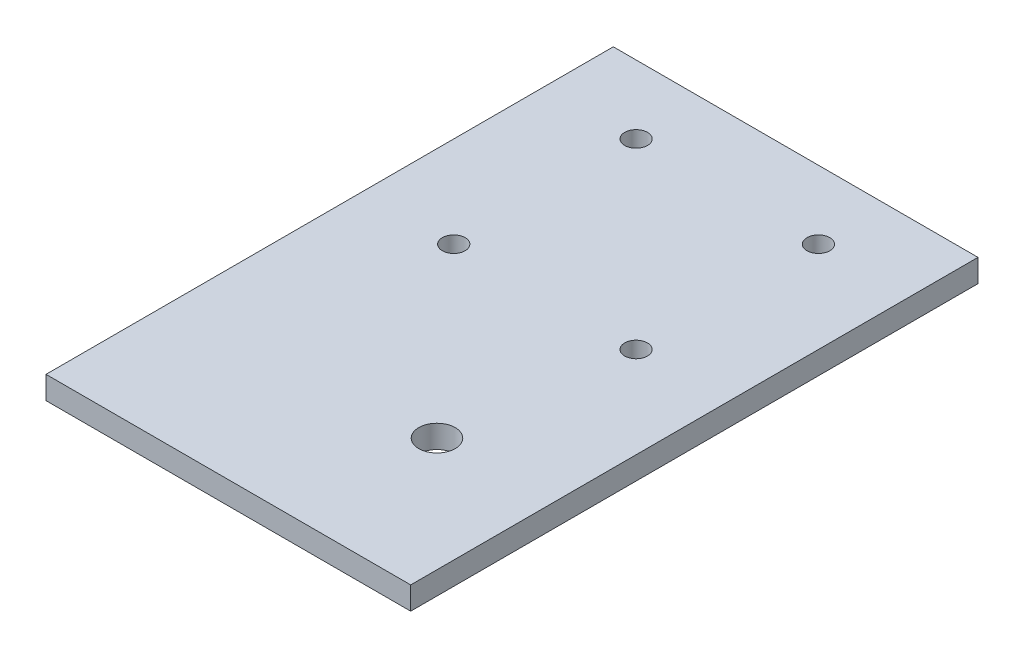
ISO-10303-21;
HEADER;
FILE_DESCRIPTION(('STEP AP214'),'2;1');
FILE_NAME('part.step','',(''),(''),'','','');
FILE_SCHEMA(('AUTOMOTIVE_DESIGN { 1 0 10303 214 1 1 1 1 }'));
ENDSEC;
DATA;
#1=APPLICATION_CONTEXT('core data for automotive mechanical design processes');
#2=APPLICATION_PROTOCOL_DEFINITION('international standard','automotive_design',2000,#1);
#3=PRODUCT_CONTEXT('',#1,'mechanical');
#4=PRODUCT('Part','Part','',(#3));
#5=PRODUCT_RELATED_PRODUCT_CATEGORY('part','',(#4));
#6=PRODUCT_DEFINITION_FORMATION('','',#4);
#7=PRODUCT_DEFINITION_CONTEXT('part definition',#1,'design');
#8=PRODUCT_DEFINITION('design','',#6,#7);
#9=PRODUCT_DEFINITION_SHAPE('','',#8);
#10=(LENGTH_UNIT() NAMED_UNIT(*) SI_UNIT(.MILLI.,.METRE.));
#11=(NAMED_UNIT(*) PLANE_ANGLE_UNIT() SI_UNIT($,.RADIAN.));
#12=(NAMED_UNIT(*) SI_UNIT($,.STERADIAN.) SOLID_ANGLE_UNIT());
#13=UNCERTAINTY_MEASURE_WITH_UNIT(LENGTH_MEASURE(1.E-05),#10,'distance_accuracy_value','');
#14=(GEOMETRIC_REPRESENTATION_CONTEXT(3) GLOBAL_UNCERTAINTY_ASSIGNED_CONTEXT((#13)) GLOBAL_UNIT_ASSIGNED_CONTEXT((#10,
#11,#12)) REPRESENTATION_CONTEXT('',''));
#15=CARTESIAN_POINT('',(0.,0.,0.));
#16=DIRECTION('',(0.,0.,1.));
#17=DIRECTION('',(1.,0.,0.));
#18=AXIS2_PLACEMENT_3D('',#15,#16,#17);
#19=CARTESIAN_POINT('',(0.,5.,0.));
#20=DIRECTION('',(0.,1.,0.));
#21=DIRECTION('',(0.,0.,1.));
#22=AXIS2_PLACEMENT_3D('',#19,#20,#21);
#23=PLANE('',#22);
#24=CARTESIAN_POINT('',(100.,5.,12.0540098199668));
#25=DIRECTION('',(0.,1.,0.));
#26=DIRECTION('',(0.,0.,-1.));
#27=AXIS2_PLACEMENT_3D('',#24,#25,#26);
#28=CIRCLE('',#27,2.49999999999999);
#29=CARTESIAN_POINT('',(100.,5.,9.5540098199668));
#30=VERTEX_POINT('',#29);
#31=EDGE_CURVE('E137',#30,#30,#28,.T.);
#32=ORIENTED_EDGE('',*,*,#31,.F.);
#33=EDGE_LOOP('',(#32));
#34=FACE_BOUND('',#33,.T.);
#35=CARTESIAN_POINT('',(60.,5.,52.0540098199677));
#36=DIRECTION('',(0.,1.,0.));
#37=DIRECTION('',(0.,0.,-1.));
#38=AXIS2_PLACEMENT_3D('',#35,#36,#37);
#39=CIRCLE('',#38,2.5);
#40=CARTESIAN_POINT('',(60.,5.,49.5540098199678));
#41=VERTEX_POINT('',#40);
#42=EDGE_CURVE('E145',#41,#41,#39,.T.);
#43=ORIENTED_EDGE('',*,*,#42,.F.);
#44=EDGE_LOOP('',(#43));
#45=FACE_BOUND('',#44,.T.);
#46=DIRECTION('',(0.,0.,1.));
#47=VECTOR('',#46,1.);
#48=CARTESIAN_POINT('',(40.,5.,-2.94599018003273));
#49=LINE('',#48,#47);
#50=CARTESIAN_POINT('',(40.,5.,-2.94599018003273));
#51=VERTEX_POINT('',#50);
#52=CARTESIAN_POINT('',(40.,5.,121.498685507254));
#53=VERTEX_POINT('',#52);
#54=EDGE_CURVE('E78',#51,#53,#49,.T.);
#55=ORIENTED_EDGE('',*,*,#54,.T.);
#56=DIRECTION('',(1.,0.,0.));
#57=VECTOR('',#56,1.);
#58=CARTESIAN_POINT('',(40.,5.,121.498685507254));
#59=LINE('',#58,#57);
#60=CARTESIAN_POINT('',(120.,5.,121.498685507254));
#61=VERTEX_POINT('',#60);
#62=EDGE_CURVE('E81',#53,#61,#59,.T.);
#63=ORIENTED_EDGE('',*,*,#62,.T.);
#64=DIRECTION('',(0.,0.,-1.));
#65=VECTOR('',#64,1.);
#66=CARTESIAN_POINT('',(120.,5.,67.0540098199673));
#67=LINE('',#66,#65);
#68=CARTESIAN_POINT('',(120.,5.,-2.94599018003273));
#69=VERTEX_POINT('',#68);
#70=EDGE_CURVE('E85',#61,#69,#67,.T.);
#71=ORIENTED_EDGE('',*,*,#70,.T.);
#72=DIRECTION('',(-1.,0.,0.));
#73=VECTOR('',#72,1.);
#74=CARTESIAN_POINT('',(40.,5.,-2.94599018003273));
#75=LINE('',#74,#73);
#76=EDGE_CURVE('E50',#69,#51,#75,.T.);
#77=ORIENTED_EDGE('',*,*,#76,.T.);
#78=EDGE_LOOP('',(#55,#63,#71,#77));
#79=FACE_BOUND('',#78,.T.);
#80=CARTESIAN_POINT('',(60.,5.,12.0540098199668));
#81=DIRECTION('',(0.,1.,0.));
#82=DIRECTION('',(0.,0.,1.));
#83=AXIS2_PLACEMENT_3D('',#80,#81,#82);
#84=CIRCLE('',#83,2.49999999999999);
#85=CARTESIAN_POINT('',(60.,5.,14.5540098199668));
#86=VERTEX_POINT('',#85);
#87=EDGE_CURVE('E99',#86,#86,#84,.T.);
#88=ORIENTED_EDGE('',*,*,#87,.F.);
#89=EDGE_LOOP('',(#88));
#90=FACE_BOUND('',#89,.T.);
#91=CARTESIAN_POINT('',(100.,5.,52.0540098199677));
#92=DIRECTION('',(0.,1.,0.));
#93=DIRECTION('',(0.,0.,1.));
#94=AXIS2_PLACEMENT_3D('',#91,#92,#93);
#95=CIRCLE('',#94,2.5);
#96=CARTESIAN_POINT('',(100.,5.,54.5540098199677));
#97=VERTEX_POINT('',#96);
#98=EDGE_CURVE('E141',#97,#97,#95,.T.);
#99=ORIENTED_EDGE('',*,*,#98,.F.);
#100=EDGE_LOOP('',(#99));
#101=FACE_BOUND('',#100,.T.);
#102=CARTESIAN_POINT('',(95.,5.,90.7340363445854));
#103=DIRECTION('',(0.,1.,0.));
#104=DIRECTION('',(0.,0.,1.));
#105=AXIS2_PLACEMENT_3D('',#102,#103,#104);
#106=CIRCLE('',#105,4.00000000000001);
#107=CARTESIAN_POINT('',(95.,5.,94.7340363445854));
#108=VERTEX_POINT('',#107);
#109=EDGE_CURVE('E132',#108,#108,#106,.T.);
#110=ORIENTED_EDGE('',*,*,#109,.F.);
#111=EDGE_LOOP('',(#110));
#112=FACE_BOUND('',#111,.T.);
#113=ADVANCED_FACE('F33',(#34,#45,#79,#90,#101,#112),#23,.T.);
#114=CARTESIAN_POINT('',(0.,0.,0.));
#115=DIRECTION('',(0.,1.,0.));
#116=DIRECTION('',(0.,0.,1.));
#117=AXIS2_PLACEMENT_3D('',#114,#115,#116);
#118=PLANE('',#117);
#119=DIRECTION('',(0.,0.,1.));
#120=VECTOR('',#119,1.);
#121=CARTESIAN_POINT('',(40.,0.,67.0540098199673));
#122=LINE('',#121,#120);
#123=CARTESIAN_POINT('',(40.,0.,-2.94599018003273));
#124=VERTEX_POINT('',#123);
#125=CARTESIAN_POINT('',(40.,0.,121.498685507254));
#126=VERTEX_POINT('',#125);
#127=EDGE_CURVE('E73',#124,#126,#122,.T.);
#128=ORIENTED_EDGE('',*,*,#127,.F.);
#129=DIRECTION('',(-1.,0.,0.));
#130=VECTOR('',#129,1.);
#131=CARTESIAN_POINT('',(40.,0.,-2.94599018003273));
#132=LINE('',#131,#130);
#133=CARTESIAN_POINT('',(120.,0.,-2.94599018003273));
#134=VERTEX_POINT('',#133);
#135=EDGE_CURVE('E102',#134,#124,#132,.T.);
#136=ORIENTED_EDGE('',*,*,#135,.F.);
#137=DIRECTION('',(0.,0.,-1.));
#138=VECTOR('',#137,1.);
#139=CARTESIAN_POINT('',(120.,0.,-2.94599018003273));
#140=LINE('',#139,#138);
#141=CARTESIAN_POINT('',(120.,0.,121.498685507254));
#142=VERTEX_POINT('',#141);
#143=EDGE_CURVE('E66',#142,#134,#140,.T.);
#144=ORIENTED_EDGE('',*,*,#143,.F.);
#145=DIRECTION('',(1.,0.,0.));
#146=VECTOR('',#145,1.);
#147=CARTESIAN_POINT('',(40.,0.,121.498685507254));
#148=LINE('',#147,#146);
#149=EDGE_CURVE('E90',#126,#142,#148,.T.);
#150=ORIENTED_EDGE('',*,*,#149,.F.);
#151=EDGE_LOOP('',(#128,#136,#144,#150));
#152=FACE_BOUND('',#151,.T.);
#153=CARTESIAN_POINT('',(60.,0.,12.0540098199668));
#154=DIRECTION('',(0.,1.,0.));
#155=DIRECTION('',(0.,0.,1.));
#156=AXIS2_PLACEMENT_3D('',#153,#154,#155);
#157=CIRCLE('',#156,2.49999999999999);
#158=CARTESIAN_POINT('',(60.,0.,14.5540098199668));
#159=VERTEX_POINT('',#158);
#160=EDGE_CURVE('E115',#159,#159,#157,.T.);
#161=ORIENTED_EDGE('',*,*,#160,.T.);
#162=EDGE_LOOP('',(#161));
#163=FACE_BOUND('',#162,.T.);
#164=CARTESIAN_POINT('',(60.,0.,52.0540098199677));
#165=DIRECTION('',(0.,1.,0.));
#166=DIRECTION('',(0.,0.,-1.));
#167=AXIS2_PLACEMENT_3D('',#164,#165,#166);
#168=CIRCLE('',#167,2.5);
#169=CARTESIAN_POINT('',(60.,0.,49.5540098199678));
#170=VERTEX_POINT('',#169);
#171=EDGE_CURVE('E119',#170,#170,#168,.T.);
#172=ORIENTED_EDGE('',*,*,#171,.T.);
#173=EDGE_LOOP('',(#172));
#174=FACE_BOUND('',#173,.T.);
#175=CARTESIAN_POINT('',(100.,0.,52.0540098199677));
#176=DIRECTION('',(0.,1.,0.));
#177=DIRECTION('',(0.,0.,1.));
#178=AXIS2_PLACEMENT_3D('',#175,#176,#177);
#179=CIRCLE('',#178,2.5);
#180=CARTESIAN_POINT('',(100.,0.,54.5540098199677));
#181=VERTEX_POINT('',#180);
#182=EDGE_CURVE('E123',#181,#181,#179,.T.);
#183=ORIENTED_EDGE('',*,*,#182,.T.);
#184=EDGE_LOOP('',(#183));
#185=FACE_BOUND('',#184,.T.);
#186=CARTESIAN_POINT('',(100.,0.,12.0540098199668));
#187=DIRECTION('',(0.,1.,0.));
#188=DIRECTION('',(0.,0.,-1.));
#189=AXIS2_PLACEMENT_3D('',#186,#187,#188);
#190=CIRCLE('',#189,2.49999999999999);
#191=CARTESIAN_POINT('',(100.,0.,9.5540098199668));
#192=VERTEX_POINT('',#191);
#193=EDGE_CURVE('E127',#192,#192,#190,.T.);
#194=ORIENTED_EDGE('',*,*,#193,.T.);
#195=EDGE_LOOP('',(#194));
#196=FACE_BOUND('',#195,.T.);
#197=CARTESIAN_POINT('',(95.,0.,90.7340363445854));
#198=DIRECTION('',(0.,1.,0.));
#199=DIRECTION('',(0.,0.,1.));
#200=AXIS2_PLACEMENT_3D('',#197,#198,#199);
#201=CIRCLE('',#200,4.00000000000001);
#202=CARTESIAN_POINT('',(95.,0.,94.7340363445854));
#203=VERTEX_POINT('',#202);
#204=EDGE_CURVE('E130',#203,#203,#201,.T.);
#205=ORIENTED_EDGE('',*,*,#204,.T.);
#206=EDGE_LOOP('',(#205));
#207=FACE_BOUND('',#206,.T.);
#208=ADVANCED_FACE('F108',(#152,#163,#174,#185,#196,#207),#118,.F.);
#209=CARTESIAN_POINT('',(40.,5.,67.0540098199673));
#210=DIRECTION('',(1.,0.,0.));
#211=DIRECTION('',(0.,0.,-1.));
#212=AXIS2_PLACEMENT_3D('',#209,#210,#211);
#213=PLANE('',#212);
#214=ORIENTED_EDGE('',*,*,#127,.T.);
#215=DIRECTION('',(0.,-1.,0.));
#216=VECTOR('',#215,1.);
#217=CARTESIAN_POINT('',(40.,5.,121.498685507254));
#218=LINE('',#217,#216);
#219=EDGE_CURVE('E11',#53,#126,#218,.T.);
#220=ORIENTED_EDGE('',*,*,#219,.F.);
#221=ORIENTED_EDGE('',*,*,#54,.F.);
#222=DIRECTION('',(0.,-1.,0.));
#223=VECTOR('',#222,1.);
#224=CARTESIAN_POINT('',(40.,5.,-2.94599018003273));
#225=LINE('',#224,#223);
#226=EDGE_CURVE('E94',#51,#124,#225,.T.);
#227=ORIENTED_EDGE('',*,*,#226,.T.);
#228=EDGE_LOOP('',(#214,#220,#221,#227));
#229=FACE_BOUND('',#228,.T.);
#230=ADVANCED_FACE('F35',(#229),#213,.F.);
#231=CARTESIAN_POINT('',(40.,5.,121.498685507254));
#232=DIRECTION('',(0.,0.,-1.));
#233=DIRECTION('',(-1.,0.,0.));
#234=AXIS2_PLACEMENT_3D('',#231,#232,#233);
#235=PLANE('',#234);
#236=ORIENTED_EDGE('',*,*,#149,.T.);
#237=DIRECTION('',(0.,-1.,0.));
#238=VECTOR('',#237,1.);
#239=CARTESIAN_POINT('',(120.,5.,121.498685507254));
#240=LINE('',#239,#238);
#241=EDGE_CURVE('E42',#61,#142,#240,.T.);
#242=ORIENTED_EDGE('',*,*,#241,.F.);
#243=ORIENTED_EDGE('',*,*,#62,.F.);
#244=ORIENTED_EDGE('',*,*,#219,.T.);
#245=EDGE_LOOP('',(#236,#242,#243,#244));
#246=FACE_BOUND('',#245,.T.);
#247=ADVANCED_FACE('F89',(#246),#235,.F.);
#248=CARTESIAN_POINT('',(120.,5.,-2.94599018003273));
#249=DIRECTION('',(-1.,0.,0.));
#250=DIRECTION('',(0.,0.,1.));
#251=AXIS2_PLACEMENT_3D('',#248,#249,#250);
#252=PLANE('',#251);
#253=ORIENTED_EDGE('',*,*,#143,.T.);
#254=DIRECTION('',(0.,-1.,0.));
#255=VECTOR('',#254,1.);
#256=CARTESIAN_POINT('',(120.,5.,-2.94599018003273));
#257=LINE('',#256,#255);
#258=EDGE_CURVE('E91',#69,#134,#257,.T.);
#259=ORIENTED_EDGE('',*,*,#258,.F.);
#260=ORIENTED_EDGE('',*,*,#70,.F.);
#261=ORIENTED_EDGE('',*,*,#241,.T.);
#262=EDGE_LOOP('',(#253,#259,#260,#261));
#263=FACE_BOUND('',#262,.T.);
#264=ADVANCED_FACE('F92',(#263),#252,.F.);
#265=CARTESIAN_POINT('',(40.,5.,-2.94599018003273));
#266=DIRECTION('',(0.,0.,1.));
#267=DIRECTION('',(1.,0.,0.));
#268=AXIS2_PLACEMENT_3D('',#265,#266,#267);
#269=PLANE('',#268);
#270=ORIENTED_EDGE('',*,*,#135,.T.);
#271=ORIENTED_EDGE('',*,*,#226,.F.);
#272=ORIENTED_EDGE('',*,*,#76,.F.);
#273=ORIENTED_EDGE('',*,*,#258,.T.);
#274=EDGE_LOOP('',(#270,#271,#272,#273));
#275=FACE_BOUND('',#274,.T.);
#276=ADVANCED_FACE('F107',(#275),#269,.F.);
#277=CARTESIAN_POINT('',(60.,5.,12.0540098199668));
#278=DIRECTION('',(0.,-1.,0.));
#279=DIRECTION('',(0.,0.,-1.));
#280=AXIS2_PLACEMENT_3D('',#277,#278,#279);
#281=CYLINDRICAL_SURFACE('',#280,2.49999999999999);
#282=ORIENTED_EDGE('',*,*,#87,.T.);
#283=EDGE_LOOP('',(#282));
#284=FACE_BOUND('',#283,.T.);
#285=ORIENTED_EDGE('',*,*,#160,.F.);
#286=EDGE_LOOP('',(#285));
#287=FACE_BOUND('',#286,.T.);
#288=ADVANCED_FACE('F153',(#284,#287),#281,.F.);
#289=CARTESIAN_POINT('',(60.,5.,52.0540098199677));
#290=DIRECTION('',(0.,-1.,0.));
#291=DIRECTION('',(0.,0.,-1.));
#292=AXIS2_PLACEMENT_3D('',#289,#290,#291);
#293=CYLINDRICAL_SURFACE('',#292,2.5);
#294=ORIENTED_EDGE('',*,*,#42,.T.);
#295=EDGE_LOOP('',(#294));
#296=FACE_BOUND('',#295,.T.);
#297=ORIENTED_EDGE('',*,*,#171,.F.);
#298=EDGE_LOOP('',(#297));
#299=FACE_BOUND('',#298,.T.);
#300=ADVANCED_FACE('F176',(#296,#299),#293,.F.);
#301=CARTESIAN_POINT('',(100.,5.,52.0540098199677));
#302=DIRECTION('',(0.,-1.,0.));
#303=DIRECTION('',(0.,0.,-1.));
#304=AXIS2_PLACEMENT_3D('',#301,#302,#303);
#305=CYLINDRICAL_SURFACE('',#304,2.5);
#306=ORIENTED_EDGE('',*,*,#98,.T.);
#307=EDGE_LOOP('',(#306));
#308=FACE_BOUND('',#307,.T.);
#309=ORIENTED_EDGE('',*,*,#182,.F.);
#310=EDGE_LOOP('',(#309));
#311=FACE_BOUND('',#310,.T.);
#312=ADVANCED_FACE('F170',(#308,#311),#305,.F.);
#313=CARTESIAN_POINT('',(100.,5.,12.0540098199668));
#314=DIRECTION('',(0.,-1.,0.));
#315=DIRECTION('',(0.,0.,-1.));
#316=AXIS2_PLACEMENT_3D('',#313,#314,#315);
#317=CYLINDRICAL_SURFACE('',#316,2.49999999999999);
#318=ORIENTED_EDGE('',*,*,#31,.T.);
#319=EDGE_LOOP('',(#318));
#320=FACE_BOUND('',#319,.T.);
#321=ORIENTED_EDGE('',*,*,#193,.F.);
#322=EDGE_LOOP('',(#321));
#323=FACE_BOUND('',#322,.T.);
#324=ADVANCED_FACE('F165',(#320,#323),#317,.F.);
#325=CARTESIAN_POINT('',(95.,5.,90.7340363445854));
#326=DIRECTION('',(0.,-1.,0.));
#327=DIRECTION('',(0.,0.,-1.));
#328=AXIS2_PLACEMENT_3D('',#325,#326,#327);
#329=CYLINDRICAL_SURFACE('',#328,4.00000000000001);
#330=ORIENTED_EDGE('',*,*,#109,.T.);
#331=EDGE_LOOP('',(#330));
#332=FACE_BOUND('',#331,.T.);
#333=ORIENTED_EDGE('',*,*,#204,.F.);
#334=EDGE_LOOP('',(#333));
#335=FACE_BOUND('',#334,.T.);
#336=ADVANCED_FACE('F163',(#332,#335),#329,.F.);
#337=CLOSED_SHELL('',(#113,#208,#230,#247,#264,#276,#288,#300,#312,#324,#336));
#338=MANIFOLD_SOLID_BREP('B2',#337);
#339=ADVANCED_BREP_SHAPE_REPRESENTATION('',(#18,#338),#14);
#340=SHAPE_DEFINITION_REPRESENTATION(#9,#339);
ENDSEC;
END-ISO-10303-21;
